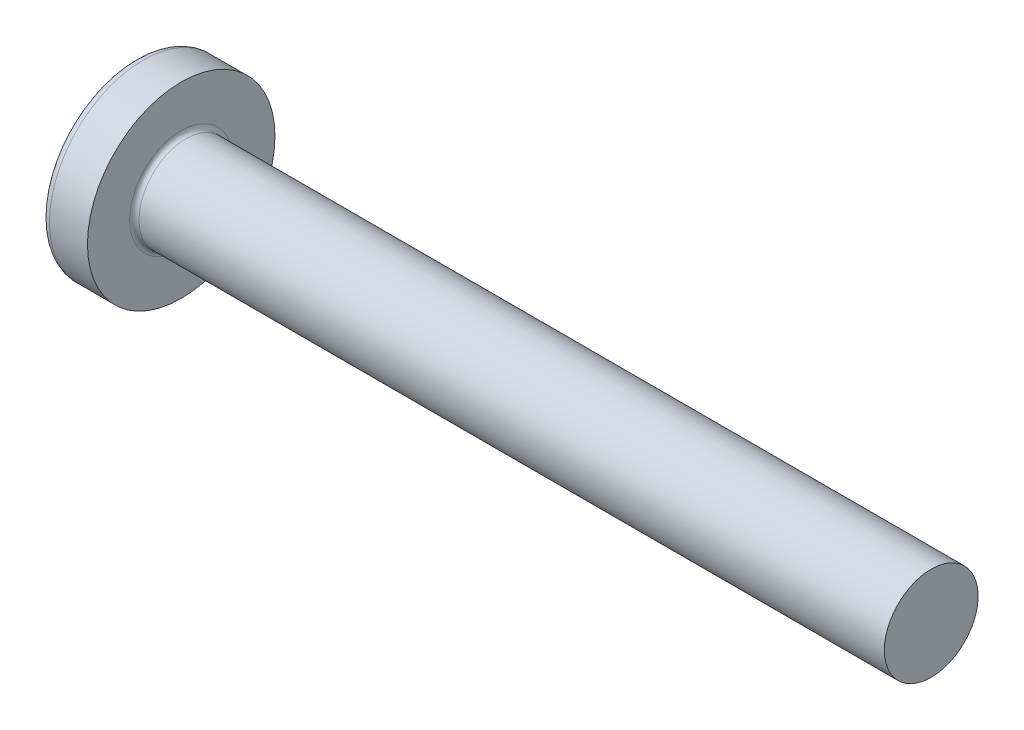
ISO-10303-21;
HEADER;
FILE_DESCRIPTION(('STEP AP214'),'2;1');
FILE_NAME('part.step','',(''),(''),'','','');
FILE_SCHEMA(('AUTOMOTIVE_DESIGN { 1 0 10303 214 1 1 1 1 }'));
ENDSEC;
DATA;
#1=APPLICATION_CONTEXT('core data for automotive mechanical design processes');
#2=APPLICATION_PROTOCOL_DEFINITION('international standard','automotive_design',2000,#1);
#3=PRODUCT_CONTEXT('',#1,'mechanical');
#4=PRODUCT('Part','Part','',(#3));
#5=PRODUCT_RELATED_PRODUCT_CATEGORY('part','',(#4));
#6=PRODUCT_DEFINITION_FORMATION('','',#4);
#7=PRODUCT_DEFINITION_CONTEXT('part definition',#1,'design');
#8=PRODUCT_DEFINITION('design','',#6,#7);
#9=PRODUCT_DEFINITION_SHAPE('','',#8);
#10=(LENGTH_UNIT() NAMED_UNIT(*) SI_UNIT(.MILLI.,.METRE.));
#11=(NAMED_UNIT(*) PLANE_ANGLE_UNIT() SI_UNIT($,.RADIAN.));
#12=(NAMED_UNIT(*) SI_UNIT($,.STERADIAN.) SOLID_ANGLE_UNIT());
#13=UNCERTAINTY_MEASURE_WITH_UNIT(LENGTH_MEASURE(1.E-05),#10,'distance_accuracy_value','');
#14=(GEOMETRIC_REPRESENTATION_CONTEXT(3) GLOBAL_UNCERTAINTY_ASSIGNED_CONTEXT((#13)) GLOBAL_UNIT_ASSIGNED_CONTEXT((#10,
#11,#12)) REPRESENTATION_CONTEXT('',''));
#15=CARTESIAN_POINT('',(0.,0.,0.));
#16=DIRECTION('',(0.,0.,1.));
#17=DIRECTION('',(1.,0.,0.));
#18=AXIS2_PLACEMENT_3D('',#15,#16,#17);
#19=CARTESIAN_POINT('',(3.2,0.,0.));
#20=DIRECTION('',(-1.,0.,0.));
#21=DIRECTION('',(0.,1.,0.));
#22=AXIS2_PLACEMENT_3D('',#19,#20,#21);
#23=SPHERICAL_SURFACE('',#22,3.2);
#24=CARTESIAN_POINT('',(0.646379599446117,0.,0.));
#25=DIRECTION('',(-1.,0.,0.));
#26=DIRECTION('',(0.,0.,1.));
#27=AXIS2_PLACEMENT_3D('',#24,#25,#26);
#28=CIRCLE('',#27,1.92847682119205);
#29=CARTESIAN_POINT('',(0.646379599446117,0.,1.92847682119205));
#30=VERTEX_POINT('',#29);
#31=EDGE_CURVE('E237',#30,#30,#28,.T.);
#32=ORIENTED_EDGE('',*,*,#31,.T.);
#33=EDGE_LOOP('',(#32));
#34=FACE_BOUND('',#33,.T.);
#35=CARTESIAN_POINT('',(0.0321614467928854,0.,0.));
#36=DIRECTION('',(1.,0.,0.));
#37=DIRECTION('',(0.,0.,-1.));
#38=AXIS2_PLACEMENT_3D('',#35,#36,#37);
#39=CIRCLE('',#38,0.452547125518057);
#40=CARTESIAN_POINT('',(0.0321614467928853,-0.239999999999998,-0.38366508938742));
#41=VERTEX_POINT('',#40);
#42=CARTESIAN_POINT('',(0.0321614467928852,-0.383665089387424,-0.24));
#43=VERTEX_POINT('',#42);
#44=EDGE_CURVE('E373',#41,#43,#39,.F.);
#45=ORIENTED_EDGE('',*,*,#44,.F.);
#46=CARTESIAN_POINT('',(3.2,-0.24,0.));
#47=DIRECTION('',(0.,1.,0.));
#48=DIRECTION('',(0.,0.,1.));
#49=AXIS2_PLACEMENT_3D('',#46,#47,#48);
#50=CIRCLE('',#49,3.19098730802866);
#51=CARTESIAN_POINT('',(0.160076673366102,-0.239999999999996,-0.970188728128246));
#52=VERTEX_POINT('',#51);
#53=EDGE_CURVE('E299',#52,#41,#50,.T.);
#54=ORIENTED_EDGE('',*,*,#53,.F.);
#55=CARTESIAN_POINT('',(2.98218780828175,0.,0.436863744320002));
#56=DIRECTION('',(0.446197753347436,0.,-0.894934391398443));
#57=DIRECTION('',(-0.894934391398442,0.,-0.446197753347436));
#58=AXIS2_PLACEMENT_3D('',#55,#56,#57);
#59=CIRCLE('',#58,3.16254769419176);
#60=CARTESIAN_POINT('',(0.160076673366103,0.240000000000003,-0.970188728128243));
#61=VERTEX_POINT('',#60);
#62=EDGE_CURVE('E271',#52,#61,#59,.T.);
#63=ORIENTED_EDGE('',*,*,#62,.T.);
#64=CARTESIAN_POINT('',(3.2,0.24,0.));
#65=DIRECTION('',(0.,-1.,0.));
#66=DIRECTION('',(0.,0.,-1.));
#67=AXIS2_PLACEMENT_3D('',#64,#65,#66);
#68=CIRCLE('',#67,3.19098730802866);
#69=CARTESIAN_POINT('',(0.0321614467928856,0.240000000000001,-0.383665089387418));
#70=VERTEX_POINT('',#69);
#71=EDGE_CURVE('E326',#70,#61,#68,.T.);
#72=ORIENTED_EDGE('',*,*,#71,.F.);
#73=CARTESIAN_POINT('',(0.0321614467928852,0.383665089387413,-0.24));
#74=VERTEX_POINT('',#73);
#75=EDGE_CURVE('E392',#74,#70,#39,.F.);
#76=ORIENTED_EDGE('',*,*,#75,.F.);
#77=CARTESIAN_POINT('',(3.2,0.,-0.24));
#78=DIRECTION('',(0.,0.,1.));
#79=DIRECTION('',(1.,0.,0.));
#80=AXIS2_PLACEMENT_3D('',#77,#78,#79);
#81=CIRCLE('',#80,3.19098730802866);
#82=CARTESIAN_POINT('',(0.160076673366104,0.970188728128243,-0.24));
#83=VERTEX_POINT('',#82);
#84=EDGE_CURVE('E265',#83,#74,#81,.T.);
#85=ORIENTED_EDGE('',*,*,#84,.F.);
#86=CARTESIAN_POINT('',(2.98218780828175,-0.436863744320003,0.));
#87=DIRECTION('',(0.446197753347436,0.894934391398443,0.));
#88=DIRECTION('',(-0.894934391398442,0.446197753347436,0.));
#89=AXIS2_PLACEMENT_3D('',#86,#87,#88);
#90=CIRCLE('',#89,3.16254769419176);
#91=CARTESIAN_POINT('',(0.160076673366105,0.970188728128243,0.24));
#92=VERTEX_POINT('',#91);
#93=EDGE_CURVE('E268',#83,#92,#90,.T.);
#94=ORIENTED_EDGE('',*,*,#93,.T.);
#95=CARTESIAN_POINT('',(3.2,0.,0.24));
#96=DIRECTION('',(0.,0.,-1.));
#97=DIRECTION('',(-1.,0.,0.));
#98=AXIS2_PLACEMENT_3D('',#95,#96,#97);
#99=CIRCLE('',#98,3.19098730802866);
#100=CARTESIAN_POINT('',(0.0321614467928854,0.383665089387413,0.239999999999999));
#101=VERTEX_POINT('',#100);
#102=EDGE_CURVE('E261',#101,#92,#99,.T.);
#103=ORIENTED_EDGE('',*,*,#102,.F.);
#104=CARTESIAN_POINT('',(0.0321614467928855,0.239999999999999,0.38366508938742));
#105=VERTEX_POINT('',#104);
#106=EDGE_CURVE('E391',#105,#101,#39,.F.);
#107=ORIENTED_EDGE('',*,*,#106,.F.);
#108=CARTESIAN_POINT('',(0.160076673366103,0.239999999999997,0.970188728128244));
#109=VERTEX_POINT('',#108);
#110=EDGE_CURVE('E281',#109,#105,#68,.T.);
#111=ORIENTED_EDGE('',*,*,#110,.F.);
#112=CARTESIAN_POINT('',(2.98218780828175,0.,-0.436863744320002));
#113=DIRECTION('',(0.446197753347436,0.,0.894934391398443));
#114=DIRECTION('',(0.894934391398442,0.,-0.446197753347436));
#115=AXIS2_PLACEMENT_3D('',#112,#113,#114);
#116=CIRCLE('',#115,3.16254769419176);
#117=CARTESIAN_POINT('',(0.160076673366103,-0.240000000000003,0.970188728128243));
#118=VERTEX_POINT('',#117);
#119=EDGE_CURVE('E48',#109,#118,#116,.T.);
#120=ORIENTED_EDGE('',*,*,#119,.T.);
#121=CARTESIAN_POINT('',(0.0321614467928852,-0.240000000000001,0.383665089387419));
#122=VERTEX_POINT('',#121);
#123=EDGE_CURVE('E278',#122,#118,#50,.T.);
#124=ORIENTED_EDGE('',*,*,#123,.F.);
#125=CARTESIAN_POINT('',(0.0321614467928854,-0.383665089387423,0.239999999999999));
#126=VERTEX_POINT('',#125);
#127=EDGE_CURVE('E427',#126,#122,#39,.F.);
#128=ORIENTED_EDGE('',*,*,#127,.F.);
#129=CARTESIAN_POINT('',(0.160076673366101,-0.970188728128245,0.239999999999999));
#130=VERTEX_POINT('',#129);
#131=EDGE_CURVE('E262',#130,#126,#99,.T.);
#132=ORIENTED_EDGE('',*,*,#131,.F.);
#133=CARTESIAN_POINT('',(2.98218780828175,0.436863744320001,0.));
#134=DIRECTION('',(0.446197753347436,-0.894934391398443,0.));
#135=DIRECTION('',(0.894934391398442,0.446197753347436,0.));
#136=AXIS2_PLACEMENT_3D('',#133,#134,#135);
#137=CIRCLE('',#136,3.16254769419176);
#138=CARTESIAN_POINT('',(0.160076673366101,-0.970188728128245,-0.24));
#139=VERTEX_POINT('',#138);
#140=EDGE_CURVE('E258',#130,#139,#137,.T.);
#141=ORIENTED_EDGE('',*,*,#140,.T.);
#142=EDGE_CURVE('E63',#43,#139,#81,.T.);
#143=ORIENTED_EDGE('',*,*,#142,.F.);
#144=EDGE_LOOP('',(#45,#54,#63,#72,#76,#85,#94,#103,#107,#111,#120,#124,#128,#132,#141,#143));
#145=FACE_BOUND('',#144,.T.);
#146=ADVANCED_FACE('F35',(#34,#145),#23,.T.);
#147=CARTESIAN_POINT('',(1.42,0.342014234961647,-0.24));
#148=DIRECTION('',(0.,0.,1.));
#149=DIRECTION('',(1.,0.,0.));
#150=AXIS2_PLACEMENT_3D('',#147,#148,#149);
#151=PLANE('',#150);
#152=ORIENTED_EDGE('',*,*,#84,.T.);
#153=CARTESIAN_POINT('',(-0.626811087646333,0.437068483432734,-0.24));
#154=CARTESIAN_POINT('',(-0.489788496188268,0.426133650699674,-0.24));
#155=CARTESIAN_POINT('',(-0.35277275089666,0.415111501640762,-0.24));
#156=CARTESIAN_POINT('',(-0.0787578829644778,0.392826208775377,-0.24));
#157=CARTESIAN_POINT('',(0.0582412392502161,0.381563059737591,-0.24));
#158=CARTESIAN_POINT('',(0.332213907654152,0.358729879929546,-0.24));
#159=CARTESIAN_POINT('',(0.469187453856035,0.347159849311357,-0.24));
#160=CARTESIAN_POINT('',(0.743097225439297,0.323608060039765,-0.24));
#161=CARTESIAN_POINT('',(0.880033451350377,0.311626307573655,-0.24));
#162=CARTESIAN_POINT('',(1.12503843743479,0.289667437089413,-0.24));
#163=CARTESIAN_POINT('',(1.23311691792,0.279799173776849,-0.24));
#164=CARTESIAN_POINT('',(1.4492267018282,0.259570129968442,-0.24));
#165=CARTESIAN_POINT('',(1.55725800577256,0.249209355061897,-0.24));
#166=CARTESIAN_POINT('',(1.77325939831777,0.227783788850472,-0.24));
#167=CARTESIAN_POINT('',(1.88122948205844,0.216718947894398,-0.24));
#168=CARTESIAN_POINT('',(2.04309848476113,0.199296215271932,-0.24));
#169=CARTESIAN_POINT('',(2.09704158415864,0.193350927204474,-0.24));
#170=CARTESIAN_POINT('',(2.20488609252136,0.181086542764125,-0.24));
#171=CARTESIAN_POINT('',(2.25878750075649,0.174767439988846,-0.24));
#172=CARTESIAN_POINT('',(2.31266102213859,0.168212174791089,-0.24));
#173=B_SPLINE_CURVE_WITH_KNOTS('',3,(#153,#154,#155,#156,#157,#158,#159,#160,#161,#162,#163,
#164,#165,#166,#167,#168,#169,#170,#171,#172),.UNSPECIFIED.,.F.,.F.,(4,2,2,2,2,2,2,2,2,4),(0.,
0.412374804430943,0.824758569256476,1.23714212973639,1.64951949568622,1.97510284899868,
2.30068250829037,2.62628515317116,2.78909323564388,2.95190410736571),.UNSPECIFIED.);
#174=CARTESIAN_POINT('',(1.42,0.262259890185289,-0.240000000000001));
#175=VERTEX_POINT('',#174);
#176=EDGE_CURVE('E413',#74,#175,#173,.T.);
#177=ORIENTED_EDGE('',*,*,#176,.T.);
#178=DIRECTION('',(0.,1.,0.));
#179=VECTOR('',#178,1.);
#180=CARTESIAN_POINT('',(1.42,-0.342014234961648,-0.24));
#181=LINE('',#180,#179);
#182=CARTESIAN_POINT('',(1.42,0.342014234961647,-0.24));
#183=VERTEX_POINT('',#182);
#184=EDGE_CURVE('E355',#175,#183,#181,.T.);
#185=ORIENTED_EDGE('',*,*,#184,.T.);
#186=DIRECTION('',(0.894934391398442,-0.446197753347436,0.));
#187=VECTOR('',#186,1.);
#188=CARTESIAN_POINT('',(0.,1.05,-0.24));
#189=LINE('',#188,#187);
#190=EDGE_CURVE('E238',#83,#183,#189,.T.);
#191=ORIENTED_EDGE('',*,*,#190,.F.);
#192=EDGE_LOOP('',(#152,#177,#185,#191));
#193=FACE_BOUND('',#192,.T.);
#194=ADVANCED_FACE('F193',(#193),#151,.T.);
#195=CARTESIAN_POINT('',(1.42,-0.342014234961648,-0.24));
#196=VERTEX_POINT('',#195);
#197=CARTESIAN_POINT('',(1.42,-0.262259890185289,-0.240000000000001));
#198=VERTEX_POINT('',#197);
#199=EDGE_CURVE('E246',#196,#198,#181,.T.);
#200=ORIENTED_EDGE('',*,*,#199,.T.);
#201=CARTESIAN_POINT('',(-0.626811087646334,-0.437068483432734,-0.24));
#202=CARTESIAN_POINT('',(-0.489788496188269,-0.426133650699674,-0.24));
#203=CARTESIAN_POINT('',(-0.352772750896661,-0.415111501640762,-0.24));
#204=CARTESIAN_POINT('',(-0.0787578829644786,-0.392826208775377,-0.24));
#205=CARTESIAN_POINT('',(0.0582412392502154,-0.381563059737591,-0.24));
#206=CARTESIAN_POINT('',(0.332213907654152,-0.358729879929546,-0.24));
#207=CARTESIAN_POINT('',(0.469187453856034,-0.347159849311357,-0.24));
#208=CARTESIAN_POINT('',(0.743097225439296,-0.323608060039765,-0.24));
#209=CARTESIAN_POINT('',(0.880033451350376,-0.311626307573655,-0.24));
#210=CARTESIAN_POINT('',(1.12503843743479,-0.289667437089413,-0.24));
#211=CARTESIAN_POINT('',(1.23311691792,-0.279799173776849,-0.24));
#212=CARTESIAN_POINT('',(1.4492267018282,-0.259570129968442,-0.24));
#213=CARTESIAN_POINT('',(1.55725800577256,-0.249209355061897,-0.24));
#214=CARTESIAN_POINT('',(1.77325939831777,-0.227783788850472,-0.24));
#215=CARTESIAN_POINT('',(1.88122948205844,-0.216718947894398,-0.24));
#216=CARTESIAN_POINT('',(2.04309848476113,-0.199296215271932,-0.24));
#217=CARTESIAN_POINT('',(2.09704158415864,-0.193350927204474,-0.24));
#218=CARTESIAN_POINT('',(2.20488609252136,-0.181086542764125,-0.24));
#219=CARTESIAN_POINT('',(2.25878750075649,-0.174767439988846,-0.24));
#220=CARTESIAN_POINT('',(2.31266102213859,-0.168212174791088,-0.24));
#221=B_SPLINE_CURVE_WITH_KNOTS('',3,(#201,#202,#203,#204,#205,#206,#207,#208,#209,#210,#211,
#212,#213,#214,#215,#216,#217,#218,#219,#220),.UNSPECIFIED.,.F.,.F.,(4,2,2,2,2,2,2,2,2,4),(0.,
0.412374804430943,0.824758569256476,1.23714212973639,1.64951949568622,1.97510284899868,
2.30068250829037,2.62628515317116,2.78909323564388,2.95190410736571),.UNSPECIFIED.);
#222=EDGE_CURVE('E390',#198,#43,#221,.F.);
#223=ORIENTED_EDGE('',*,*,#222,.T.);
#224=ORIENTED_EDGE('',*,*,#142,.T.);
#225=DIRECTION('',(0.894934391398442,0.446197753347436,0.));
#226=VECTOR('',#225,1.);
#227=CARTESIAN_POINT('',(0.,-1.05,-0.24));
#228=LINE('',#227,#226);
#229=EDGE_CURVE('E329',#139,#196,#228,.T.);
#230=ORIENTED_EDGE('',*,*,#229,.T.);
#231=EDGE_LOOP('',(#200,#223,#224,#230));
#232=FACE_BOUND('',#231,.T.);
#233=ADVANCED_FACE('F199',(#232),#151,.T.);
#234=CARTESIAN_POINT('',(1.42,-0.342014234961647,0.24));
#235=DIRECTION('',(0.,0.,-1.));
#236=DIRECTION('',(-1.,0.,0.));
#237=AXIS2_PLACEMENT_3D('',#234,#235,#236);
#238=PLANE('',#237);
#239=DIRECTION('',(0.,-1.,0.));
#240=VECTOR('',#239,1.);
#241=CARTESIAN_POINT('',(1.42,0.342014234961647,0.24));
#242=LINE('',#241,#240);
#243=CARTESIAN_POINT('',(1.42,0.342014234961647,0.24));
#244=VERTEX_POINT('',#243);
#245=CARTESIAN_POINT('',(1.42,0.262259890185289,0.240000000000001));
#246=VERTEX_POINT('',#245);
#247=EDGE_CURVE('E338',#244,#246,#242,.T.);
#248=ORIENTED_EDGE('',*,*,#247,.T.);
#249=CARTESIAN_POINT('',(-0.626811087646333,0.437068483432734,0.239999999999999));
#250=CARTESIAN_POINT('',(-0.489788496188267,0.426133650699674,0.239999999999999));
#251=CARTESIAN_POINT('',(-0.35277275089666,0.415111501640762,0.239999999999999));
#252=CARTESIAN_POINT('',(-0.0787578829644775,0.392826208775377,0.239999999999999));
#253=CARTESIAN_POINT('',(0.0582412392502165,0.381563059737591,0.239999999999999));
#254=CARTESIAN_POINT('',(0.332213907654153,0.358729879929546,0.239999999999999));
#255=CARTESIAN_POINT('',(0.469187453856035,0.347159849311358,0.239999999999999));
#256=CARTESIAN_POINT('',(0.743097225439297,0.323608060039765,0.24));
#257=CARTESIAN_POINT('',(0.880033451350377,0.311626307573655,0.24));
#258=CARTESIAN_POINT('',(1.12503843743479,0.289667437089413,0.24));
#259=CARTESIAN_POINT('',(1.23311691792,0.279799173776849,0.24));
#260=CARTESIAN_POINT('',(1.4492267018282,0.259570129968442,0.24));
#261=CARTESIAN_POINT('',(1.55725800577256,0.249209355061897,0.24));
#262=CARTESIAN_POINT('',(1.77325939831777,0.227783788850472,0.24));
#263=CARTESIAN_POINT('',(1.88122948205844,0.216718947894399,0.24));
#264=CARTESIAN_POINT('',(2.04309848476113,0.199296215271932,0.24));
#265=CARTESIAN_POINT('',(2.09704158415864,0.193350927204474,0.24));
#266=CARTESIAN_POINT('',(2.20488609252136,0.181086542764125,0.24));
#267=CARTESIAN_POINT('',(2.25878750075649,0.174767439988846,0.24));
#268=CARTESIAN_POINT('',(2.31266102213859,0.168212174791088,0.24));
#269=B_SPLINE_CURVE_WITH_KNOTS('',3,(#249,#250,#251,#252,#253,#254,#255,#256,#257,#258,#259,
#260,#261,#262,#263,#264,#265,#266,#267,#268),.UNSPECIFIED.,.F.,.F.,(4,2,2,2,2,2,2,2,2,4),(0.,
0.412374804430943,0.824758569256476,1.23714212973639,1.64951949568622,1.97510284899868,
2.30068250829037,2.62628515317116,2.78909323564388,2.95190410736571),.UNSPECIFIED.);
#270=EDGE_CURVE('E665',#246,#101,#269,.F.);
#271=ORIENTED_EDGE('',*,*,#270,.T.);
#272=ORIENTED_EDGE('',*,*,#102,.T.);
#273=DIRECTION('',(0.894934391398442,-0.446197753347436,0.));
#274=VECTOR('',#273,1.);
#275=CARTESIAN_POINT('',(0.,1.05,0.24));
#276=LINE('',#275,#274);
#277=EDGE_CURVE('E243',#92,#244,#276,.T.);
#278=ORIENTED_EDGE('',*,*,#277,.T.);
#279=EDGE_LOOP('',(#248,#271,#272,#278));
#280=FACE_BOUND('',#279,.T.);
#281=ADVANCED_FACE('F409',(#280),#238,.T.);
#282=ORIENTED_EDGE('',*,*,#131,.T.);
#283=CARTESIAN_POINT('',(-0.626811087646334,-0.437068483432734,0.239999999999999));
#284=CARTESIAN_POINT('',(-0.489788496188268,-0.426133650699674,0.239999999999999));
#285=CARTESIAN_POINT('',(-0.35277275089666,-0.415111501640762,0.239999999999999));
#286=CARTESIAN_POINT('',(-0.0787578829644783,-0.392826208775377,0.239999999999999));
#287=CARTESIAN_POINT('',(0.0582412392502158,-0.381563059737591,0.239999999999999));
#288=CARTESIAN_POINT('',(0.332213907654152,-0.358729879929547,0.239999999999999));
#289=CARTESIAN_POINT('',(0.469187453856034,-0.347159849311358,0.239999999999999));
#290=CARTESIAN_POINT('',(0.743097225439297,-0.323608060039765,0.24));
#291=CARTESIAN_POINT('',(0.880033451350377,-0.311626307573655,0.24));
#292=CARTESIAN_POINT('',(1.12503843743479,-0.289667437089414,0.24));
#293=CARTESIAN_POINT('',(1.23311691791999,-0.279799173776849,0.24));
#294=CARTESIAN_POINT('',(1.4492267018282,-0.259570129968442,0.24));
#295=CARTESIAN_POINT('',(1.55725800577256,-0.249209355061897,0.24));
#296=CARTESIAN_POINT('',(1.77325939831777,-0.227783788850472,0.24));
#297=CARTESIAN_POINT('',(1.88122948205844,-0.216718947894399,0.24));
#298=CARTESIAN_POINT('',(2.04309848476113,-0.199296215271932,0.24));
#299=CARTESIAN_POINT('',(2.09704158415864,-0.193350927204474,0.24));
#300=CARTESIAN_POINT('',(2.20488609252136,-0.181086542764125,0.24));
#301=CARTESIAN_POINT('',(2.25878750075649,-0.174767439988846,0.24));
#302=CARTESIAN_POINT('',(2.31266102213859,-0.168212174791088,0.24));
#303=B_SPLINE_CURVE_WITH_KNOTS('',3,(#283,#284,#285,#286,#287,#288,#289,#290,#291,#292,#293,
#294,#295,#296,#297,#298,#299,#300,#301,#302),.UNSPECIFIED.,.F.,.F.,(4,2,2,2,2,2,2,2,2,4),(0.,
0.412374804430943,0.824758569256476,1.23714212973639,1.64951949568622,1.97510284899868,
2.30068250829037,2.62628515317116,2.78909323564388,2.95190410736571),.UNSPECIFIED.);
#304=CARTESIAN_POINT('',(1.42,-0.262259890185289,0.240000000000001));
#305=VERTEX_POINT('',#304);
#306=EDGE_CURVE('E428',#126,#305,#303,.T.);
#307=ORIENTED_EDGE('',*,*,#306,.T.);
#308=CARTESIAN_POINT('',(1.42,-0.342014234961648,0.24));
#309=VERTEX_POINT('',#308);
#310=EDGE_CURVE('E340',#305,#309,#242,.T.);
#311=ORIENTED_EDGE('',*,*,#310,.T.);
#312=DIRECTION('',(0.894934391398442,0.446197753347436,0.));
#313=VECTOR('',#312,1.);
#314=CARTESIAN_POINT('',(0.,-1.05,0.239999999999999));
#315=LINE('',#314,#313);
#316=EDGE_CURVE('E331',#130,#309,#315,.T.);
#317=ORIENTED_EDGE('',*,*,#316,.F.);
#318=EDGE_LOOP('',(#282,#307,#311,#317));
#319=FACE_BOUND('',#318,.T.);
#320=ADVANCED_FACE('F513',(#319),#238,.T.);
#321=CARTESIAN_POINT('',(1.42,0.342014234961647,0.24));
#322=DIRECTION('',(0.446197753347436,0.894934391398443,0.));
#323=DIRECTION('',(-0.894934391398442,0.446197753347436,0.));
#324=AXIS2_PLACEMENT_3D('',#321,#322,#323);
#325=PLANE('',#324);
#326=CARTESIAN_POINT('',(2.01772965253961,0.0439972734550524,0.));
#327=DIRECTION('',(0.446197753347436,0.894934391398443,0.));
#328=DIRECTION('',(-0.894934391398443,0.446197753347436,0.));
#329=AXIS2_PLACEMENT_3D('',#326,#327,#328);
#330=ELLIPSE('',#329,0.703057486597294,0.310602005333466);
#331=CARTESIAN_POINT('',(1.42,0.342014234961648,0.0969871799961127));
#332=VERTEX_POINT('',#331);
#333=CARTESIAN_POINT('',(1.42,0.342014234961648,-0.096987179996113));
#334=VERTEX_POINT('',#333);
#335=EDGE_CURVE('E304',#332,#334,#330,.F.);
#336=ORIENTED_EDGE('',*,*,#335,.F.);
#337=DIRECTION('',(0.,0.,-1.));
#338=VECTOR('',#337,1.);
#339=CARTESIAN_POINT('',(1.42,0.342014234961647,0.24));
#340=LINE('',#339,#338);
#341=EDGE_CURVE('E341',#244,#332,#340,.T.);
#342=ORIENTED_EDGE('',*,*,#341,.F.);
#343=ORIENTED_EDGE('',*,*,#277,.F.);
#344=ORIENTED_EDGE('',*,*,#93,.F.);
#345=ORIENTED_EDGE('',*,*,#190,.T.);
#346=EDGE_CURVE('E343',#334,#183,#340,.T.);
#347=ORIENTED_EDGE('',*,*,#346,.F.);
#348=EDGE_LOOP('',(#336,#342,#343,#344,#345,#347));
#349=FACE_BOUND('',#348,.T.);
#350=ADVANCED_FACE('F407',(#349),#325,.F.);
#351=CARTESIAN_POINT('',(1.42,-0.342014234961648,-0.24));
#352=DIRECTION('',(0.446197753347436,-0.894934391398443,0.));
#353=DIRECTION('',(0.894934391398442,0.446197753347436,0.));
#354=AXIS2_PLACEMENT_3D('',#351,#352,#353);
#355=PLANE('',#354);
#356=CARTESIAN_POINT('',(2.01772965253961,-0.0439972734550524,0.));
#357=DIRECTION('',(0.446197753347436,-0.894934391398443,0.));
#358=DIRECTION('',(-0.894934391398443,-0.446197753347436,0.));
#359=AXIS2_PLACEMENT_3D('',#356,#357,#358);
#360=ELLIPSE('',#359,0.703057486597294,0.310602005333466);
#361=CARTESIAN_POINT('',(1.42,-0.342014234961649,-0.0969871799961107));
#362=VERTEX_POINT('',#361);
#363=CARTESIAN_POINT('',(1.42,-0.342014234961649,0.0969871799961103));
#364=VERTEX_POINT('',#363);
#365=EDGE_CURVE('E667',#362,#364,#360,.F.);
#366=ORIENTED_EDGE('',*,*,#365,.F.);
#367=DIRECTION('',(0.,0.,1.));
#368=VECTOR('',#367,1.);
#369=CARTESIAN_POINT('',(1.42,-0.342014234961648,-0.24));
#370=LINE('',#369,#368);
#371=EDGE_CURVE('E334',#196,#362,#370,.T.);
#372=ORIENTED_EDGE('',*,*,#371,.F.);
#373=ORIENTED_EDGE('',*,*,#229,.F.);
#374=ORIENTED_EDGE('',*,*,#140,.F.);
#375=ORIENTED_EDGE('',*,*,#316,.T.);
#376=EDGE_CURVE('E337',#364,#309,#370,.T.);
#377=ORIENTED_EDGE('',*,*,#376,.F.);
#378=EDGE_LOOP('',(#366,#372,#373,#374,#375,#377));
#379=FACE_BOUND('',#378,.T.);
#380=ADVANCED_FACE('F500',(#379),#355,.F.);
#381=CARTESIAN_POINT('',(1.42,0.342014234961647,-0.24));
#382=DIRECTION('',(-1.,0.,0.));
#383=DIRECTION('',(0.,0.,1.));
#384=AXIS2_PLACEMENT_3D('',#381,#382,#383);
#385=PLANE('',#384);
#386=DIRECTION('',(0.,1.,0.));
#387=VECTOR('',#386,1.);
#388=CARTESIAN_POINT('',(1.42,-0.240000000000001,0.342014234961646));
#389=LINE('',#388,#387);
#390=CARTESIAN_POINT('',(1.42,-0.240000000000001,0.342014234961646));
#391=VERTEX_POINT('',#390);
#392=CARTESIAN_POINT('',(1.42,-0.0969871799961171,0.342014234961647));
#393=VERTEX_POINT('',#392);
#394=EDGE_CURVE('E319',#391,#393,#389,.T.);
#395=ORIENTED_EDGE('',*,*,#394,.T.);
#396=CARTESIAN_POINT('',(1.42,0.,0.));
#397=DIRECTION('',(-1.,0.,0.));
#398=DIRECTION('',(0.,0.,1.));
#399=AXIS2_PLACEMENT_3D('',#396,#397,#398);
#400=CIRCLE('',#399,0.3555);
#401=CARTESIAN_POINT('',(1.42,-0.240000000000001,0.262259890185289));
#402=VERTEX_POINT('',#401);
#403=EDGE_CURVE('E693',#402,#393,#400,.T.);
#404=ORIENTED_EDGE('',*,*,#403,.F.);
#405=DIRECTION('',(0.,0.,-1.));
#406=VECTOR('',#405,1.);
#407=CARTESIAN_POINT('',(1.42,-0.240000000000001,0.342014234961646));
#408=LINE('',#407,#406);
#409=EDGE_CURVE('E315',#391,#402,#408,.T.);
#410=ORIENTED_EDGE('',*,*,#409,.F.);
#411=EDGE_LOOP('',(#395,#404,#410));
#412=FACE_BOUND('',#411,.T.);
#413=ADVANCED_FACE('F493',(#412),#385,.T.);
#414=ORIENTED_EDGE('',*,*,#310,.F.);
#415=EDGE_CURVE('E698',#364,#305,#400,.T.);
#416=ORIENTED_EDGE('',*,*,#415,.F.);
#417=ORIENTED_EDGE('',*,*,#376,.T.);
#418=EDGE_LOOP('',(#414,#416,#417));
#419=FACE_BOUND('',#418,.T.);
#420=ADVANCED_FACE('F486',(#419),#385,.T.);
#421=ORIENTED_EDGE('',*,*,#371,.T.);
#422=EDGE_CURVE('E384',#198,#362,#400,.T.);
#423=ORIENTED_EDGE('',*,*,#422,.F.);
#424=ORIENTED_EDGE('',*,*,#199,.F.);
#425=EDGE_LOOP('',(#421,#423,#424));
#426=FACE_BOUND('',#425,.T.);
#427=ADVANCED_FACE('F480',(#426),#385,.T.);
#428=CARTESIAN_POINT('',(1.42,-0.239999999999999,-0.262259890185288));
#429=VERTEX_POINT('',#428);
#430=CARTESIAN_POINT('',(1.42,-0.239999999999999,-0.342014234961649));
#431=VERTEX_POINT('',#430);
#432=EDGE_CURVE('E318',#429,#431,#408,.T.);
#433=ORIENTED_EDGE('',*,*,#432,.F.);
#434=CARTESIAN_POINT('',(1.42,-0.0969871799961125,-0.342014234961648));
#435=VERTEX_POINT('',#434);
#436=EDGE_CURVE('E55',#435,#429,#400,.T.);
#437=ORIENTED_EDGE('',*,*,#436,.F.);
#438=DIRECTION('',(0.,-1.,0.));
#439=VECTOR('',#438,1.);
#440=CARTESIAN_POINT('',(1.42,0.240000000000001,-0.342014234961647));
#441=LINE('',#440,#439);
#442=EDGE_CURVE('E314',#435,#431,#441,.T.);
#443=ORIENTED_EDGE('',*,*,#442,.T.);
#444=EDGE_LOOP('',(#433,#437,#443));
#445=FACE_BOUND('',#444,.T.);
#446=ADVANCED_FACE('F379',(#445),#385,.T.);
#447=CARTESIAN_POINT('',(1.42,0.240000000000001,-0.342014234961647));
#448=VERTEX_POINT('',#447);
#449=CARTESIAN_POINT('',(1.42,0.0969871799961153,-0.342014234961648));
#450=VERTEX_POINT('',#449);
#451=EDGE_CURVE('E311',#448,#450,#441,.T.);
#452=ORIENTED_EDGE('',*,*,#451,.T.);
#453=CARTESIAN_POINT('',(1.42,0.240000000000001,-0.262259890185288));
#454=VERTEX_POINT('',#453);
#455=EDGE_CURVE('E383',#454,#450,#400,.T.);
#456=ORIENTED_EDGE('',*,*,#455,.F.);
#457=DIRECTION('',(0.,0.,1.));
#458=VECTOR('',#457,1.);
#459=CARTESIAN_POINT('',(1.42,0.240000000000001,-0.342014234961647));
#460=LINE('',#459,#458);
#461=EDGE_CURVE('E323',#448,#454,#460,.T.);
#462=ORIENTED_EDGE('',*,*,#461,.F.);
#463=EDGE_LOOP('',(#452,#456,#462));
#464=FACE_BOUND('',#463,.T.);
#465=ADVANCED_FACE('F468',(#464),#385,.T.);
#466=ORIENTED_EDGE('',*,*,#184,.F.);
#467=EDGE_CURVE('E682',#334,#175,#400,.T.);
#468=ORIENTED_EDGE('',*,*,#467,.F.);
#469=ORIENTED_EDGE('',*,*,#346,.T.);
#470=EDGE_LOOP('',(#466,#468,#469));
#471=FACE_BOUND('',#470,.T.);
#472=ADVANCED_FACE('F461',(#471),#385,.T.);
#473=ORIENTED_EDGE('',*,*,#341,.T.);
#474=EDGE_CURVE('E684',#246,#332,#400,.T.);
#475=ORIENTED_EDGE('',*,*,#474,.F.);
#476=ORIENTED_EDGE('',*,*,#247,.F.);
#477=EDGE_LOOP('',(#473,#475,#476));
#478=FACE_BOUND('',#477,.T.);
#479=ADVANCED_FACE('F455',(#478),#385,.T.);
#480=CARTESIAN_POINT('',(1.42,0.239999999999999,0.342014234961648));
#481=DIRECTION('',(0.,-1.,0.));
#482=DIRECTION('',(1.,0.,0.));
#483=AXIS2_PLACEMENT_3D('',#480,#481,#482);
#484=PLANE('',#483);
#485=ORIENTED_EDGE('',*,*,#110,.T.);
#486=CARTESIAN_POINT('',(-0.626811087646333,0.239999999999998,0.437068483432735));
#487=CARTESIAN_POINT('',(-0.489788496188267,0.239999999999999,0.426133650699675));
#488=CARTESIAN_POINT('',(-0.35277275089666,0.239999999999999,0.415111501640762));
#489=CARTESIAN_POINT('',(-0.0787578829644776,0.239999999999999,0.392826208775378));
#490=CARTESIAN_POINT('',(0.0582412392502165,0.239999999999999,0.381563059737592));
#491=CARTESIAN_POINT('',(0.332213907654153,0.239999999999999,0.358729879929547));
#492=CARTESIAN_POINT('',(0.469187453856035,0.239999999999999,0.347159849311358));
#493=CARTESIAN_POINT('',(0.743097225439297,0.239999999999999,0.323608060039766));
#494=CARTESIAN_POINT('',(0.880033451350377,0.239999999999999,0.311626307573656));
#495=CARTESIAN_POINT('',(1.12503843743479,0.239999999999999,0.289667437089414));
#496=CARTESIAN_POINT('',(1.23311691792,0.239999999999999,0.279799173776849));
#497=CARTESIAN_POINT('',(1.4492267018282,0.239999999999999,0.259570129968442));
#498=CARTESIAN_POINT('',(1.55725800577256,0.239999999999999,0.249209355061898));
#499=CARTESIAN_POINT('',(1.77325939831777,0.239999999999999,0.227783788850473));
#500=CARTESIAN_POINT('',(1.88122948205844,0.239999999999999,0.216718947894399));
#501=CARTESIAN_POINT('',(2.04309848476113,0.239999999999999,0.199296215271933));
#502=CARTESIAN_POINT('',(2.09704158415864,0.239999999999999,0.193350927204475));
#503=CARTESIAN_POINT('',(2.20488609252136,0.239999999999999,0.181086542764126));
#504=CARTESIAN_POINT('',(2.25878750075649,0.239999999999999,0.174767439988847));
#505=CARTESIAN_POINT('',(2.31266102213859,0.239999999999999,0.168212174791089));
#506=B_SPLINE_CURVE_WITH_KNOTS('',3,(#486,#487,#488,#489,#490,#491,#492,#493,#494,#495,#496,
#497,#498,#499,#500,#501,#502,#503,#504,#505),.UNSPECIFIED.,.F.,.F.,(4,2,2,2,2,2,2,2,2,4),(0.,
0.412374804430943,0.824758569256476,1.23714212973639,1.64951949568622,1.97510284899868,
2.30068250829037,2.62628515317116,2.78909323564388,2.95190410736571),.UNSPECIFIED.);
#507=CARTESIAN_POINT('',(1.42,0.239999999999999,0.26225989018529));
#508=VERTEX_POINT('',#507);
#509=EDGE_CURVE('E664',#105,#508,#506,.T.);
#510=ORIENTED_EDGE('',*,*,#509,.T.);
#511=CARTESIAN_POINT('',(1.42,0.239999999999999,0.342014234961648));
#512=VERTEX_POINT('',#511);
#513=EDGE_CURVE('E296',#508,#512,#460,.T.);
#514=ORIENTED_EDGE('',*,*,#513,.T.);
#515=DIRECTION('',(0.894934391398442,0.,-0.446197753347436));
#516=VECTOR('',#515,1.);
#517=CARTESIAN_POINT('',(0.,0.239999999999996,1.05));
#518=LINE('',#517,#516);
#519=EDGE_CURVE('E289',#109,#512,#518,.T.);
#520=ORIENTED_EDGE('',*,*,#519,.F.);
#521=EDGE_LOOP('',(#485,#510,#514,#520));
#522=FACE_BOUND('',#521,.T.);
#523=ADVANCED_FACE('F293',(#522),#484,.T.);
#524=CARTESIAN_POINT('',(1.42,-0.239999999999999,-0.342014234961648));
#525=DIRECTION('',(0.,1.,0.));
#526=DIRECTION('',(-1.,0.,0.));
#527=AXIS2_PLACEMENT_3D('',#524,#525,#526);
#528=PLANE('',#527);
#529=ORIENTED_EDGE('',*,*,#409,.T.);
#530=CARTESIAN_POINT('',(-0.626811087693631,-0.240000000000001,0.437068483436507));
#531=CARTESIAN_POINT('',(-0.489788496230297,-0.240000000000001,0.426133650703048));
#532=CARTESIAN_POINT('',(-0.352772750933422,-0.240000000000001,0.415111501643733));
#533=CARTESIAN_POINT('',(-0.0787578829907063,-0.240000000000001,0.392826208777528));
#534=CARTESIAN_POINT('',(0.0582412392292545,-0.240000000000001,0.381563059739325));
#535=CARTESIAN_POINT('',(0.332213907649303,-0.240000000000001,0.358729879929962));
#536=CARTESIAN_POINT('',(0.46918745386203,-0.240000000000001,0.347159849310858));
#537=CARTESIAN_POINT('',(0.743097225466974,-0.240000000000001,0.323608060037367));
#538=CARTESIAN_POINT('',(0.880033451388893,-0.240000000000001,0.311626307570274));
#539=CARTESIAN_POINT('',(1.12503843748414,-0.240000000000001,0.289667437084934));
#540=CARTESIAN_POINT('',(1.23311691796933,-0.240000000000001,0.279799173772306));
#541=CARTESIAN_POINT('',(1.44922670187753,-0.240000000000001,0.259570129963747));
#542=CARTESIAN_POINT('',(1.55725800582188,-0.240000000000001,0.249209355057114));
#543=CARTESIAN_POINT('',(1.77325939836707,-0.240000000000001,0.22778378884547));
#544=CARTESIAN_POINT('',(1.88122948210773,-0.240000000000001,0.216718947889266));
#545=CARTESIAN_POINT('',(2.0430984848104,-0.240000000000001,0.199296215266542));
#546=CARTESIAN_POINT('',(2.0970415842079,-0.240000000000001,0.193350927198988));
#547=CARTESIAN_POINT('',(2.20488609257059,-0.240000000000001,0.181086542758412));
#548=CARTESIAN_POINT('',(2.25878750080571,-0.240000000000001,0.174767439983004));
#549=CARTESIAN_POINT('',(2.31266102218779,-0.240000000000001,0.168212174785093));
#550=B_SPLINE_CURVE_WITH_KNOTS('',3,(#530,#531,#532,#533,#534,#535,#536,#537,#538,#539,#540,
#541,#542,#543,#544,#545,#546,#547,#548,#549),.UNSPECIFIED.,.F.,.F.,(4,2,2,2,2,2,2,2,2,4),(0.,
0.412374804446791,0.824758569288173,1.23714212980074,1.64951949578321,1.97510284909568,
2.30068250838737,2.62628515326816,2.78909323574089,2.95190410746272),.UNSPECIFIED.);
#551=EDGE_CURVE('E421',#402,#122,#550,.F.);
#552=ORIENTED_EDGE('',*,*,#551,.T.);
#553=ORIENTED_EDGE('',*,*,#123,.T.);
#554=DIRECTION('',(0.894934391398442,0.,-0.446197753347436));
#555=VECTOR('',#554,1.);
#556=CARTESIAN_POINT('',(0.,-0.240000000000003,1.05));
#557=LINE('',#556,#555);
#558=EDGE_CURVE('E291',#118,#391,#557,.T.);
#559=ORIENTED_EDGE('',*,*,#558,.T.);
#560=EDGE_LOOP('',(#529,#552,#553,#559));
#561=FACE_BOUND('',#560,.T.);
#562=ADVANCED_FACE('F228',(#561),#528,.T.);
#563=CARTESIAN_POINT('',(1.42,-0.240000000000001,0.342014234961646));
#564=DIRECTION('',(0.446197753347436,0.,0.894934391398443));
#565=DIRECTION('',(-0.894934391398442,0.,0.446197753347436));
#566=AXIS2_PLACEMENT_3D('',#563,#564,#565);
#567=PLANE('',#566);
#568=CARTESIAN_POINT('',(2.01772965253961,0.,0.0439972734550524));
#569=DIRECTION('',(0.446197753347436,0.,0.894934391398443));
#570=DIRECTION('',(-0.894934391398443,0.,0.446197753347436));
#571=AXIS2_PLACEMENT_3D('',#568,#569,#570);
#572=ELLIPSE('',#571,0.703057486597294,0.310602005333466);
#573=CARTESIAN_POINT('',(1.42,0.096987179996115,0.342014234961648));
#574=VERTEX_POINT('',#573);
#575=EDGE_CURVE('E419',#393,#574,#572,.F.);
#576=ORIENTED_EDGE('',*,*,#575,.F.);
#577=ORIENTED_EDGE('',*,*,#394,.F.);
#578=ORIENTED_EDGE('',*,*,#558,.F.);
#579=ORIENTED_EDGE('',*,*,#119,.F.);
#580=ORIENTED_EDGE('',*,*,#519,.T.);
#581=EDGE_CURVE('E322',#574,#512,#389,.T.);
#582=ORIENTED_EDGE('',*,*,#581,.F.);
#583=EDGE_LOOP('',(#576,#577,#578,#579,#580,#582));
#584=FACE_BOUND('',#583,.T.);
#585=ADVANCED_FACE('F287',(#584),#567,.F.);
#586=CARTESIAN_POINT('',(1.42,0.240000000000001,-0.342014234961647));
#587=DIRECTION('',(0.446197753347436,0.,-0.894934391398443));
#588=DIRECTION('',(0.894934391398442,0.,0.446197753347436));
#589=AXIS2_PLACEMENT_3D('',#586,#587,#588);
#590=PLANE('',#589);
#591=CARTESIAN_POINT('',(2.01772965253961,0.,-0.0439972734550523));
#592=DIRECTION('',(0.446197753347436,0.,-0.894934391398443));
#593=DIRECTION('',(-0.894934391398443,0.,-0.446197753347436));
#594=AXIS2_PLACEMENT_3D('',#591,#592,#593);
#595=ELLIPSE('',#594,0.703057486597294,0.310602005333466);
#596=EDGE_CURVE('E377',#450,#435,#595,.F.);
#597=ORIENTED_EDGE('',*,*,#596,.F.);
#598=ORIENTED_EDGE('',*,*,#451,.F.);
#599=DIRECTION('',(0.894934391398442,0.,0.446197753347436));
#600=VECTOR('',#599,1.);
#601=CARTESIAN_POINT('',(0.,0.240000000000004,-1.05));
#602=LINE('',#601,#600);
#603=EDGE_CURVE('E301',#61,#448,#602,.T.);
#604=ORIENTED_EDGE('',*,*,#603,.F.);
#605=ORIENTED_EDGE('',*,*,#62,.F.);
#606=DIRECTION('',(0.894934391398442,0.,0.446197753347436));
#607=VECTOR('',#606,1.);
#608=CARTESIAN_POINT('',(0.,-0.239999999999996,-1.05));
#609=LINE('',#608,#607);
#610=EDGE_CURVE('E308',#52,#431,#609,.T.);
#611=ORIENTED_EDGE('',*,*,#610,.T.);
#612=ORIENTED_EDGE('',*,*,#442,.F.);
#613=EDGE_LOOP('',(#597,#598,#604,#605,#611,#612));
#614=FACE_BOUND('',#613,.T.);
#615=ADVANCED_FACE('F368',(#614),#590,.F.);
#616=ORIENTED_EDGE('',*,*,#461,.T.);
#617=CARTESIAN_POINT('',(-0.62681108769363,0.240000000000001,-0.437068483436506));
#618=CARTESIAN_POINT('',(-0.489788496230297,0.240000000000001,-0.426133650703047));
#619=CARTESIAN_POINT('',(-0.352772750933422,0.240000000000001,-0.415111501643732));
#620=CARTESIAN_POINT('',(-0.078757882990706,0.240000000000001,-0.392826208777528));
#621=CARTESIAN_POINT('',(0.0582412392292549,0.240000000000001,-0.381563059739325));
#622=CARTESIAN_POINT('',(0.332213907649304,0.240000000000001,-0.358729879929961));
#623=CARTESIAN_POINT('',(0.46918745386203,0.240000000000001,-0.347159849310858));
#624=CARTESIAN_POINT('',(0.743097225466975,0.240000000000001,-0.323608060037367));
#625=CARTESIAN_POINT('',(0.880033451388893,0.240000000000001,-0.311626307570273));
#626=CARTESIAN_POINT('',(1.12503843748414,0.240000000000001,-0.289667437084934));
#627=CARTESIAN_POINT('',(1.23311691796934,0.240000000000001,-0.279799173772306));
#628=CARTESIAN_POINT('',(1.44922670187753,0.240000000000001,-0.259570129963747));
#629=CARTESIAN_POINT('',(1.55725800582188,0.240000000000001,-0.249209355057114));
#630=CARTESIAN_POINT('',(1.77325939836707,0.240000000000001,-0.22778378884547));
#631=CARTESIAN_POINT('',(1.88122948210773,0.240000000000001,-0.216718947889266));
#632=CARTESIAN_POINT('',(2.0430984848104,0.240000000000001,-0.199296215266542));
#633=CARTESIAN_POINT('',(2.0970415842079,0.240000000000001,-0.193350927198988));
#634=CARTESIAN_POINT('',(2.20488609257059,0.240000000000001,-0.181086542758413));
#635=CARTESIAN_POINT('',(2.25878750080571,0.240000000000001,-0.174767439983004));
#636=CARTESIAN_POINT('',(2.31266102218779,0.240000000000001,-0.168212174785093));
#637=B_SPLINE_CURVE_WITH_KNOTS('',3,(#617,#618,#619,#620,#621,#622,#623,#624,#625,#626,#627,
#628,#629,#630,#631,#632,#633,#634,#635,#636),.UNSPECIFIED.,.F.,.F.,(4,2,2,2,2,2,2,2,2,4),(0.,
0.412374804446791,0.824758569288173,1.23714212980074,1.64951949578321,1.97510284909568,
2.30068250838736,2.62628515326816,2.78909323574089,2.95190410746272),.UNSPECIFIED.);
#638=EDGE_CURVE('E364',#454,#70,#637,.F.);
#639=ORIENTED_EDGE('',*,*,#638,.T.);
#640=ORIENTED_EDGE('',*,*,#71,.T.);
#641=ORIENTED_EDGE('',*,*,#603,.T.);
#642=EDGE_LOOP('',(#616,#639,#640,#641));
#643=FACE_BOUND('',#642,.T.);
#644=ADVANCED_FACE('F226',(#643),#484,.T.);
#645=ORIENTED_EDGE('',*,*,#53,.T.);
#646=CARTESIAN_POINT('',(-0.626811087693631,-0.239999999999998,-0.437068483436508));
#647=CARTESIAN_POINT('',(-0.489788496230298,-0.239999999999998,-0.42613365070305));
#648=CARTESIAN_POINT('',(-0.352772750933423,-0.239999999999998,-0.415111501643734));
#649=CARTESIAN_POINT('',(-0.0787578829907064,-0.239999999999998,-0.39282620877753));
#650=CARTESIAN_POINT('',(0.0582412392292544,-0.239999999999998,-0.381563059739327));
#651=CARTESIAN_POINT('',(0.332213907649303,-0.239999999999998,-0.358729879929963));
#652=CARTESIAN_POINT('',(0.46918745386203,-0.239999999999998,-0.34715984931086));
#653=CARTESIAN_POINT('',(0.743097225466974,-0.239999999999998,-0.323608060037369));
#654=CARTESIAN_POINT('',(0.880033451388893,-0.239999999999999,-0.311626307570275));
#655=CARTESIAN_POINT('',(1.12503843748414,-0.239999999999999,-0.289667437084936));
#656=CARTESIAN_POINT('',(1.23311691796933,-0.239999999999999,-0.279799173772308));
#657=CARTESIAN_POINT('',(1.44922670187753,-0.239999999999999,-0.259570129963749));
#658=CARTESIAN_POINT('',(1.55725800582188,-0.239999999999999,-0.249209355057116));
#659=CARTESIAN_POINT('',(1.77325939836707,-0.239999999999999,-0.227783788845472));
#660=CARTESIAN_POINT('',(1.88122948210773,-0.239999999999999,-0.216718947889268));
#661=CARTESIAN_POINT('',(2.0430984848104,-0.239999999999999,-0.199296215266544));
#662=CARTESIAN_POINT('',(2.0970415842079,-0.239999999999999,-0.19335092719899));
#663=CARTESIAN_POINT('',(2.20488609257059,-0.239999999999999,-0.181086542758414));
#664=CARTESIAN_POINT('',(2.25878750080571,-0.239999999999999,-0.174767439983005));
#665=CARTESIAN_POINT('',(2.31266102218779,-0.239999999999999,-0.168212174785095));
#666=B_SPLINE_CURVE_WITH_KNOTS('',3,(#646,#647,#648,#649,#650,#651,#652,#653,#654,#655,#656,
#657,#658,#659,#660,#661,#662,#663,#664,#665),.UNSPECIFIED.,.F.,.F.,(4,2,2,2,2,2,2,2,2,4),(0.,
0.412374804446791,0.824758569288174,1.23714212980074,1.64951949578321,1.97510284909568,
2.30068250838737,2.62628515326816,2.78909323574089,2.95190410746272),.UNSPECIFIED.);
#667=EDGE_CURVE('E11',#41,#429,#666,.T.);
#668=ORIENTED_EDGE('',*,*,#667,.T.);
#669=ORIENTED_EDGE('',*,*,#432,.T.);
#670=ORIENTED_EDGE('',*,*,#610,.F.);
#671=EDGE_LOOP('',(#645,#668,#669,#670));
#672=FACE_BOUND('',#671,.T.);
#673=ADVANCED_FACE('F221',(#672),#528,.T.);
#674=CARTESIAN_POINT('',(-25.4,0.,0.));
#675=DIRECTION('',(-1.,0.,0.));
#676=DIRECTION('',(0.,0.,1.));
#677=AXIS2_PLACEMENT_3D('',#674,#675,#676);
#678=CYLINDRICAL_SURFACE('',#677,1.);
#679=CARTESIAN_POINT('',(1.7,0.,0.));
#680=DIRECTION('',(-1.,0.,0.));
#681=DIRECTION('',(0.,0.,1.));
#682=AXIS2_PLACEMENT_3D('',#679,#680,#681);
#683=CIRCLE('',#682,1.);
#684=CARTESIAN_POINT('',(1.7,0.,1.));
#685=VERTEX_POINT('',#684);
#686=EDGE_CURVE('E232',#685,#685,#683,.F.);
#687=ORIENTED_EDGE('',*,*,#686,.T.);
#688=EDGE_LOOP('',(#687));
#689=FACE_BOUND('',#688,.T.);
#690=CARTESIAN_POINT('',(17.6,0.,0.));
#691=DIRECTION('',(-1.,0.,0.));
#692=DIRECTION('',(0.,0.,1.));
#693=AXIS2_PLACEMENT_3D('',#690,#691,#692);
#694=CIRCLE('',#693,1.);
#695=CARTESIAN_POINT('',(17.6,0.,1.));
#696=VERTEX_POINT('',#695);
#697=EDGE_CURVE('E235',#696,#696,#694,.T.);
#698=ORIENTED_EDGE('',*,*,#697,.T.);
#699=EDGE_LOOP('',(#698));
#700=FACE_BOUND('',#699,.T.);
#701=ADVANCED_FACE('F218',(#689,#700),#678,.T.);
#702=CARTESIAN_POINT('',(1.6,1.,0.));
#703=DIRECTION('',(-1.,0.,0.));
#704=DIRECTION('',(0.,0.,1.));
#705=AXIS2_PLACEMENT_3D('',#702,#703,#704);
#706=PLANE('',#705);
#707=CARTESIAN_POINT('',(1.6,0.,0.));
#708=DIRECTION('',(-1.,0.,0.));
#709=DIRECTION('',(0.,0.,1.));
#710=AXIS2_PLACEMENT_3D('',#707,#708,#709);
#711=CIRCLE('',#710,1.1);
#712=CARTESIAN_POINT('',(1.6,0.,1.1));
#713=VERTEX_POINT('',#712);
#714=EDGE_CURVE('E254',#713,#713,#711,.T.);
#715=ORIENTED_EDGE('',*,*,#714,.T.);
#716=EDGE_LOOP('',(#715));
#717=FACE_BOUND('',#716,.T.);
#718=CARTESIAN_POINT('',(1.6,0.,0.));
#719=DIRECTION('',(-1.,0.,0.));
#720=DIRECTION('',(0.,0.,1.));
#721=AXIS2_PLACEMENT_3D('',#718,#719,#720);
#722=CIRCLE('',#721,2.);
#723=CARTESIAN_POINT('',(1.6,0.,2.));
#724=VERTEX_POINT('',#723);
#725=EDGE_CURVE('E251',#724,#724,#722,.T.);
#726=ORIENTED_EDGE('',*,*,#725,.F.);
#727=EDGE_LOOP('',(#726));
#728=FACE_BOUND('',#727,.T.);
#729=ADVANCED_FACE('F215',(#717,#728),#706,.F.);
#730=CARTESIAN_POINT('',(-25.4,0.,0.));
#731=DIRECTION('',(-1.,0.,0.));
#732=DIRECTION('',(0.,0.,1.));
#733=AXIS2_PLACEMENT_3D('',#730,#731,#732);
#734=CYLINDRICAL_SURFACE('',#733,2.);
#735=ORIENTED_EDGE('',*,*,#725,.T.);
#736=EDGE_LOOP('',(#735));
#737=FACE_BOUND('',#736,.T.);
#738=CARTESIAN_POINT('',(0.790020746977274,0.,0.));
#739=DIRECTION('',(-1.,0.,0.));
#740=DIRECTION('',(0.,0.,1.));
#741=AXIS2_PLACEMENT_3D('',#738,#739,#740);
#742=CIRCLE('',#741,2.);
#743=CARTESIAN_POINT('',(0.790020746977274,0.,2.));
#744=VERTEX_POINT('',#743);
#745=EDGE_CURVE('E240',#744,#744,#742,.T.);
#746=ORIENTED_EDGE('',*,*,#745,.F.);
#747=EDGE_LOOP('',(#746));
#748=FACE_BOUND('',#747,.T.);
#749=ADVANCED_FACE('F211',(#737,#748),#734,.T.);
#750=CARTESIAN_POINT('',(0.790020746977273,0.,0.));
#751=DIRECTION('',(-1.,0.,0.));
#752=DIRECTION('',(0.,0.,1.));
#753=AXIS2_PLACEMENT_3D('',#750,#751,#752);
#754=TOROIDAL_SURFACE('',#753,1.82,0.18);
#755=ORIENTED_EDGE('',*,*,#745,.T.);
#756=EDGE_LOOP('',(#755));
#757=FACE_BOUND('',#756,.T.);
#758=ORIENTED_EDGE('',*,*,#31,.F.);
#759=EDGE_LOOP('',(#758));
#760=FACE_BOUND('',#759,.T.);
#761=ADVANCED_FACE('F208',(#757,#760),#754,.T.);
#762=CARTESIAN_POINT('',(17.6,1.,0.));
#763=DIRECTION('',(1.,0.,0.));
#764=DIRECTION('',(0.,0.,-1.));
#765=AXIS2_PLACEMENT_3D('',#762,#763,#764);
#766=PLANE('',#765);
#767=ORIENTED_EDGE('',*,*,#697,.F.);
#768=EDGE_LOOP('',(#767));
#769=FACE_BOUND('',#768,.T.);
#770=ADVANCED_FACE('F206',(#769),#766,.T.);
#771=CARTESIAN_POINT('',(1.7,0.,0.));
#772=DIRECTION('',(-1.,0.,0.));
#773=DIRECTION('',(0.,0.,1.));
#774=AXIS2_PLACEMENT_3D('',#771,#772,#773);
#775=TOROIDAL_SURFACE('',#774,1.1,0.1);
#776=ORIENTED_EDGE('',*,*,#686,.F.);
#777=EDGE_LOOP('',(#776));
#778=FACE_BOUND('',#777,.T.);
#779=ORIENTED_EDGE('',*,*,#714,.F.);
#780=EDGE_LOOP('',(#779));
#781=FACE_BOUND('',#780,.T.);
#782=ADVANCED_FACE('F37',(#778,#781),#775,.F.);
#783=ORIENTED_EDGE('',*,*,#513,.F.);
#784=EDGE_CURVE('E385',#574,#508,#400,.T.);
#785=ORIENTED_EDGE('',*,*,#784,.F.);
#786=ORIENTED_EDGE('',*,*,#581,.T.);
#787=EDGE_LOOP('',(#783,#785,#786));
#788=FACE_BOUND('',#787,.T.);
#789=ADVANCED_FACE('F462',(#788),#385,.T.);
#790=CARTESIAN_POINT('',(1.42,0.,0.));
#791=DIRECTION('',(-1.,0.,0.));
#792=DIRECTION('',(0.,0.,1.));
#793=AXIS2_PLACEMENT_3D('',#790,#791,#792);
#794=CONICAL_SURFACE('',#793,0.3555,0.069813170079766);
#795=ORIENTED_EDGE('',*,*,#335,.T.);
#796=EDGE_CURVE('E679',#332,#334,#400,.T.);
#797=ORIENTED_EDGE('',*,*,#796,.F.);
#798=EDGE_LOOP('',(#795,#797));
#799=FACE_BOUND('',#798,.T.);
#800=ADVANCED_FACE('F190',(#799),#794,.F.);
#801=ORIENTED_EDGE('',*,*,#365,.T.);
#802=EDGE_CURVE('E699',#362,#364,#400,.T.);
#803=ORIENTED_EDGE('',*,*,#802,.F.);
#804=EDGE_LOOP('',(#801,#803));
#805=FACE_BOUND('',#804,.T.);
#806=ADVANCED_FACE('F595',(#805),#794,.F.);
#807=EDGE_CURVE('E387',#508,#246,#400,.T.);
#808=ORIENTED_EDGE('',*,*,#807,.F.);
#809=ORIENTED_EDGE('',*,*,#509,.F.);
#810=ORIENTED_EDGE('',*,*,#106,.T.);
#811=ORIENTED_EDGE('',*,*,#270,.F.);
#812=EDGE_LOOP('',(#808,#809,#810,#811));
#813=FACE_BOUND('',#812,.T.);
#814=ADVANCED_FACE('F601',(#813),#794,.F.);
#815=ORIENTED_EDGE('',*,*,#575,.T.);
#816=EDGE_CURVE('E388',#393,#574,#400,.T.);
#817=ORIENTED_EDGE('',*,*,#816,.F.);
#818=EDGE_LOOP('',(#815,#817));
#819=FACE_BOUND('',#818,.T.);
#820=ADVANCED_FACE('F608',(#819),#794,.F.);
#821=ORIENTED_EDGE('',*,*,#596,.T.);
#822=EDGE_CURVE('E380',#450,#435,#400,.T.);
#823=ORIENTED_EDGE('',*,*,#822,.F.);
#824=EDGE_LOOP('',(#821,#823));
#825=FACE_BOUND('',#824,.T.);
#826=ADVANCED_FACE('F615',(#825),#794,.F.);
#827=ORIENTED_EDGE('',*,*,#127,.T.);
#828=ORIENTED_EDGE('',*,*,#551,.F.);
#829=EDGE_CURVE('E695',#305,#402,#400,.T.);
#830=ORIENTED_EDGE('',*,*,#829,.F.);
#831=ORIENTED_EDGE('',*,*,#306,.F.);
#832=EDGE_LOOP('',(#827,#828,#830,#831));
#833=FACE_BOUND('',#832,.T.);
#834=ADVANCED_FACE('F622',(#833),#794,.F.);
#835=ORIENTED_EDGE('',*,*,#75,.T.);
#836=ORIENTED_EDGE('',*,*,#638,.F.);
#837=EDGE_CURVE('E685',#175,#454,#400,.T.);
#838=ORIENTED_EDGE('',*,*,#837,.F.);
#839=ORIENTED_EDGE('',*,*,#176,.F.);
#840=EDGE_LOOP('',(#835,#836,#838,#839));
#841=FACE_BOUND('',#840,.T.);
#842=ADVANCED_FACE('F188',(#841),#794,.F.);
#843=EDGE_CURVE('E381',#429,#198,#400,.T.);
#844=ORIENTED_EDGE('',*,*,#843,.F.);
#845=ORIENTED_EDGE('',*,*,#667,.F.);
#846=ORIENTED_EDGE('',*,*,#44,.T.);
#847=ORIENTED_EDGE('',*,*,#222,.F.);
#848=EDGE_LOOP('',(#844,#845,#846,#847));
#849=FACE_BOUND('',#848,.T.);
#850=ADVANCED_FACE('F183',(#849),#794,.F.);
#851=CARTESIAN_POINT('',(1.53550895201079,0.,0.));
#852=DIRECTION('',(-1.,0.,0.));
#853=DIRECTION('',(0.,0.,1.));
#854=AXIS2_PLACEMENT_3D('',#851,#852,#853);
#855=CONICAL_SURFACE('',#854,0.,1.25663706143593);
#856=ORIENTED_EDGE('',*,*,#784,.T.);
#857=ORIENTED_EDGE('',*,*,#807,.T.);
#858=ORIENTED_EDGE('',*,*,#474,.T.);
#859=ORIENTED_EDGE('',*,*,#796,.T.);
#860=ORIENTED_EDGE('',*,*,#467,.T.);
#861=ORIENTED_EDGE('',*,*,#837,.T.);
#862=ORIENTED_EDGE('',*,*,#455,.T.);
#863=ORIENTED_EDGE('',*,*,#822,.T.);
#864=ORIENTED_EDGE('',*,*,#436,.T.);
#865=ORIENTED_EDGE('',*,*,#843,.T.);
#866=ORIENTED_EDGE('',*,*,#422,.T.);
#867=ORIENTED_EDGE('',*,*,#802,.T.);
#868=ORIENTED_EDGE('',*,*,#415,.T.);
#869=ORIENTED_EDGE('',*,*,#829,.T.);
#870=ORIENTED_EDGE('',*,*,#403,.T.);
#871=ORIENTED_EDGE('',*,*,#816,.T.);
#872=EDGE_LOOP('',(#856,#857,#858,#859,#860,#861,#862,#863,#864,#865,#866,#867,#868,#869,#870,#871));
#873=FACE_BOUND('',#872,.T.);
#874=CARTESIAN_POINT('',(1.53550895201079,0.,0.));
#875=VERTEX_POINT('',#874);
#876=VERTEX_LOOP('',#875);
#877=FACE_BOUND('',#876,.T.);
#878=ADVANCED_FACE('F181',(#873,#877),#855,.F.);
#879=CLOSED_SHELL('',(#146,#194,#233,#281,#320,#350,#380,#413,#420,#427,#446,#465,#472,#479,
#523,#562,#585,#615,#644,#673,#701,#729,#749,#761,#770,#782,#789,#800,#806,#814,#820,#826,#834,
#842,#850,#878));
#880=MANIFOLD_SOLID_BREP('B2',#879);
#881=ADVANCED_BREP_SHAPE_REPRESENTATION('',(#18,#880),#14);
#882=SHAPE_DEFINITION_REPRESENTATION(#9,#881);
ENDSEC;
END-ISO-10303-21;
